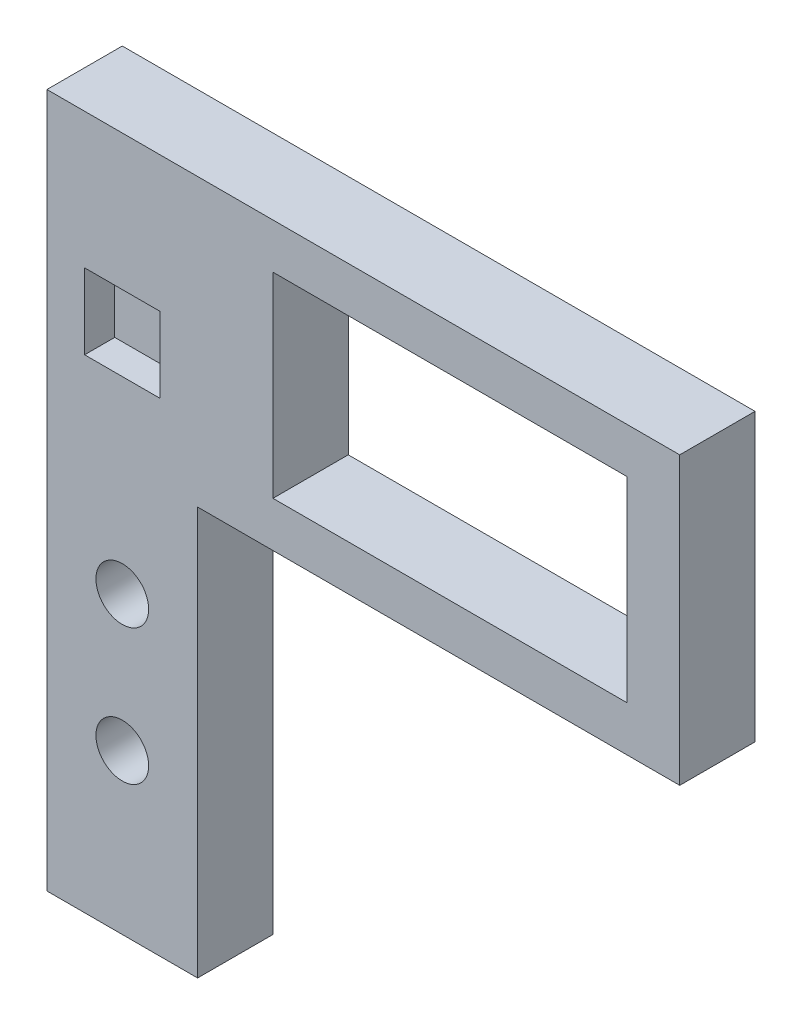
ISO-10303-21;
HEADER;
FILE_DESCRIPTION(('STEP AP214'),'2;1');
FILE_NAME('part.step','',(''),(''),'','','');
FILE_SCHEMA(('AUTOMOTIVE_DESIGN { 1 0 10303 214 1 1 1 1 }'));
ENDSEC;
DATA;
#1=APPLICATION_CONTEXT('core data for automotive mechanical design processes');
#2=APPLICATION_PROTOCOL_DEFINITION('international standard','automotive_design',2000,#1);
#3=PRODUCT_CONTEXT('',#1,'mechanical');
#4=PRODUCT('Part','Part','',(#3));
#5=PRODUCT_RELATED_PRODUCT_CATEGORY('part','',(#4));
#6=PRODUCT_DEFINITION_FORMATION('','',#4);
#7=PRODUCT_DEFINITION_CONTEXT('part definition',#1,'design');
#8=PRODUCT_DEFINITION('design','',#6,#7);
#9=PRODUCT_DEFINITION_SHAPE('','',#8);
#10=(LENGTH_UNIT() NAMED_UNIT(*) SI_UNIT(.MILLI.,.METRE.));
#11=(NAMED_UNIT(*) PLANE_ANGLE_UNIT() SI_UNIT($,.RADIAN.));
#12=(NAMED_UNIT(*) SI_UNIT($,.STERADIAN.) SOLID_ANGLE_UNIT());
#13=UNCERTAINTY_MEASURE_WITH_UNIT(LENGTH_MEASURE(1.E-05),#10,'distance_accuracy_value','');
#14=(GEOMETRIC_REPRESENTATION_CONTEXT(3) GLOBAL_UNCERTAINTY_ASSIGNED_CONTEXT((#13)) GLOBAL_UNIT_ASSIGNED_CONTEXT((#10,
#11,#12)) REPRESENTATION_CONTEXT('',''));
#15=CARTESIAN_POINT('',(0.,0.,0.));
#16=DIRECTION('',(0.,0.,1.));
#17=DIRECTION('',(1.,0.,0.));
#18=AXIS2_PLACEMENT_3D('',#15,#16,#17);
#19=CARTESIAN_POINT('',(0.,0.,5.));
#20=DIRECTION('',(0.,0.,1.));
#21=DIRECTION('',(1.,0.,0.));
#22=AXIS2_PLACEMENT_3D('',#19,#20,#21);
#23=PLANE('',#22);
#24=DIRECTION('',(0.,-1.,0.));
#25=VECTOR('',#24,1.);
#26=CARTESIAN_POINT('',(33.5,0.,5.));
#27=LINE('',#26,#25);
#28=CARTESIAN_POINT('',(33.5,30.9257415875545,5.));
#29=VERTEX_POINT('',#28);
#30=CARTESIAN_POINT('',(33.5,17.9257415875545,5.));
#31=VERTEX_POINT('',#30);
#32=EDGE_CURVE('E225',#29,#31,#27,.T.);
#33=ORIENTED_EDGE('',*,*,#32,.T.);
#34=DIRECTION('',(-1.,0.,0.));
#35=VECTOR('',#34,1.);
#36=CARTESIAN_POINT('',(0.,17.9257415875545,5.));
#37=LINE('',#36,#35);
#38=CARTESIAN_POINT('',(10.,17.9257415875545,5.));
#39=VERTEX_POINT('',#38);
#40=EDGE_CURVE('E113',#31,#39,#37,.T.);
#41=ORIENTED_EDGE('',*,*,#40,.T.);
#42=DIRECTION('',(0.,-1.,0.));
#43=VECTOR('',#42,1.);
#44=CARTESIAN_POINT('',(10.,0.,5.));
#45=LINE('',#44,#43);
#46=CARTESIAN_POINT('',(10.,30.9257415875545,5.));
#47=VERTEX_POINT('',#46);
#48=EDGE_CURVE('E258',#47,#39,#45,.T.);
#49=ORIENTED_EDGE('',*,*,#48,.F.);
#50=DIRECTION('',(1.,0.,0.));
#51=VECTOR('',#50,1.);
#52=CARTESIAN_POINT('',(0.,30.9257415875545,5.));
#53=LINE('',#52,#51);
#54=EDGE_CURVE('E260',#47,#29,#53,.T.);
#55=ORIENTED_EDGE('',*,*,#54,.T.);
#56=EDGE_LOOP('',(#33,#41,#49,#55));
#57=FACE_BOUND('',#56,.T.);
#58=DIRECTION('',(-1.,0.,0.));
#59=VECTOR('',#58,1.);
#60=CARTESIAN_POINT('',(0.,14.9257415875545,5.));
#61=LINE('',#60,#59);
#62=CARTESIAN_POINT('',(37.,14.9257415875545,5.));
#63=VERTEX_POINT('',#62);
#64=CARTESIAN_POINT('',(5.,14.9257415875545,5.));
#65=VERTEX_POINT('',#64);
#66=EDGE_CURVE('E264',#63,#65,#61,.T.);
#67=ORIENTED_EDGE('',*,*,#66,.F.);
#68=DIRECTION('',(0.,-1.,0.));
#69=VECTOR('',#68,1.);
#70=CARTESIAN_POINT('',(37.,0.,5.));
#71=LINE('',#70,#69);
#72=CARTESIAN_POINT('',(37.,33.9257415875545,5.));
#73=VERTEX_POINT('',#72);
#74=EDGE_CURVE('E274',#73,#63,#71,.T.);
#75=ORIENTED_EDGE('',*,*,#74,.F.);
#76=DIRECTION('',(-1.,0.,0.));
#77=VECTOR('',#76,1.);
#78=CARTESIAN_POINT('',(0.,33.9257415875545,5.));
#79=LINE('',#78,#77);
#80=CARTESIAN_POINT('',(-5.,33.9257415875545,5.));
#81=VERTEX_POINT('',#80);
#82=EDGE_CURVE('E147',#73,#81,#79,.T.);
#83=ORIENTED_EDGE('',*,*,#82,.T.);
#84=DIRECTION('',(0.,-1.,0.));
#85=VECTOR('',#84,1.);
#86=CARTESIAN_POINT('',(-5.,0.,5.));
#87=LINE('',#86,#85);
#88=CARTESIAN_POINT('',(-4.99999999999999,-12.1472359222569,5.));
#89=VERTEX_POINT('',#88);
#90=EDGE_CURVE('E138',#81,#89,#87,.T.);
#91=ORIENTED_EDGE('',*,*,#90,.T.);
#92=DIRECTION('',(-1.,0.,0.));
#93=VECTOR('',#92,1.);
#94=CARTESIAN_POINT('',(0.,-12.1472359222569,5.));
#95=LINE('',#94,#93);
#96=CARTESIAN_POINT('',(5.,-12.1472359222569,5.));
#97=VERTEX_POINT('',#96);
#98=EDGE_CURVE('E144',#97,#89,#95,.T.);
#99=ORIENTED_EDGE('',*,*,#98,.F.);
#100=DIRECTION('',(0.,-1.,0.));
#101=VECTOR('',#100,1.);
#102=CARTESIAN_POINT('',(5.,0.,5.));
#103=LINE('',#102,#101);
#104=EDGE_CURVE('E166',#65,#97,#103,.T.);
#105=ORIENTED_EDGE('',*,*,#104,.F.);
#106=EDGE_LOOP('',(#67,#75,#83,#91,#99,#105));
#107=FACE_BOUND('',#106,.T.);
#108=CARTESIAN_POINT('',(0.,-1.57425841244552,5.));
#109=DIRECTION('',(0.,0.,1.));
#110=DIRECTION('',(1.,0.,0.));
#111=AXIS2_PLACEMENT_3D('',#108,#109,#110);
#112=CIRCLE('',#111,1.75);
#113=CARTESIAN_POINT('',(1.75,-1.57425841244552,5.));
#114=VERTEX_POINT('',#113);
#115=EDGE_CURVE('E169',#114,#114,#112,.T.);
#116=ORIENTED_EDGE('',*,*,#115,.F.);
#117=EDGE_LOOP('',(#116));
#118=FACE_BOUND('',#117,.T.);
#119=CARTESIAN_POINT('',(0.,7.42574158755448,5.));
#120=DIRECTION('',(0.,0.,1.));
#121=DIRECTION('',(1.,0.,0.));
#122=AXIS2_PLACEMENT_3D('',#119,#120,#121);
#123=CIRCLE('',#122,1.75);
#124=CARTESIAN_POINT('',(1.75,7.42574158755448,5.));
#125=VERTEX_POINT('',#124);
#126=EDGE_CURVE('E176',#125,#125,#123,.T.);
#127=ORIENTED_EDGE('',*,*,#126,.F.);
#128=EDGE_LOOP('',(#127));
#129=FACE_BOUND('',#128,.T.);
#130=DIRECTION('',(-1.,0.,0.));
#131=VECTOR('',#130,1.);
#132=CARTESIAN_POINT('',(-2.5,19.9257415875545,5.));
#133=LINE('',#132,#131);
#134=CARTESIAN_POINT('',(2.5,19.9257415875545,5.));
#135=VERTEX_POINT('',#134);
#136=CARTESIAN_POINT('',(-2.5,19.9257415875545,5.));
#137=VERTEX_POINT('',#136);
#138=EDGE_CURVE('E522',#135,#137,#133,.T.);
#139=ORIENTED_EDGE('',*,*,#138,.T.);
#140=DIRECTION('',(0.,1.,0.));
#141=VECTOR('',#140,1.);
#142=CARTESIAN_POINT('',(-2.5,24.9257415875545,5.));
#143=LINE('',#142,#141);
#144=CARTESIAN_POINT('',(-2.5,24.9257415875545,5.));
#145=VERTEX_POINT('',#144);
#146=EDGE_CURVE('E59',#137,#145,#143,.T.);
#147=ORIENTED_EDGE('',*,*,#146,.T.);
#148=DIRECTION('',(1.,0.,0.));
#149=VECTOR('',#148,1.);
#150=CARTESIAN_POINT('',(-2.5,24.9257415875545,5.));
#151=LINE('',#150,#149);
#152=CARTESIAN_POINT('',(2.5,24.9257415875545,5.));
#153=VERTEX_POINT('',#152);
#154=EDGE_CURVE('E540',#145,#153,#151,.T.);
#155=ORIENTED_EDGE('',*,*,#154,.T.);
#156=DIRECTION('',(0.,-1.,0.));
#157=VECTOR('',#156,1.);
#158=CARTESIAN_POINT('',(2.5,24.9257415875545,5.));
#159=LINE('',#158,#157);
#160=EDGE_CURVE('E529',#153,#135,#159,.T.);
#161=ORIENTED_EDGE('',*,*,#160,.T.);
#162=EDGE_LOOP('',(#139,#147,#155,#161));
#163=FACE_BOUND('',#162,.T.);
#164=ADVANCED_FACE('F41',(#57,#107,#118,#129,#163),#23,.T.);
#165=CARTESIAN_POINT('',(0.,14.9257415875545,5.));
#166=DIRECTION('',(0.,-1.,0.));
#167=DIRECTION('',(1.,0.,0.));
#168=AXIS2_PLACEMENT_3D('',#165,#166,#167);
#169=PLANE('',#168);
#170=DIRECTION('',(-1.,0.,0.));
#171=VECTOR('',#170,1.);
#172=CARTESIAN_POINT('',(0.,14.9257415875545,0.));
#173=LINE('',#172,#171);
#174=CARTESIAN_POINT('',(37.,14.9257415875545,0.));
#175=VERTEX_POINT('',#174);
#176=CARTESIAN_POINT('',(5.,14.9257415875545,0.));
#177=VERTEX_POINT('',#176);
#178=EDGE_CURVE('E197',#175,#177,#173,.T.);
#179=ORIENTED_EDGE('',*,*,#178,.F.);
#180=DIRECTION('',(0.,0.,-1.));
#181=VECTOR('',#180,1.);
#182=CARTESIAN_POINT('',(37.,14.9257415875545,5.));
#183=LINE('',#182,#181);
#184=EDGE_CURVE('E11',#63,#175,#183,.T.);
#185=ORIENTED_EDGE('',*,*,#184,.F.);
#186=ORIENTED_EDGE('',*,*,#66,.T.);
#187=DIRECTION('',(0.,0.,-1.));
#188=VECTOR('',#187,1.);
#189=CARTESIAN_POINT('',(5.,14.9257415875545,5.));
#190=LINE('',#189,#188);
#191=EDGE_CURVE('E68',#65,#177,#190,.T.);
#192=ORIENTED_EDGE('',*,*,#191,.T.);
#193=EDGE_LOOP('',(#179,#185,#186,#192));
#194=FACE_BOUND('',#193,.T.);
#195=ADVANCED_FACE('F281',(#194),#169,.T.);
#196=CARTESIAN_POINT('',(37.,0.,5.));
#197=DIRECTION('',(1.,0.,0.));
#198=DIRECTION('',(0.,0.,-1.));
#199=AXIS2_PLACEMENT_3D('',#196,#197,#198);
#200=PLANE('',#199);
#201=DIRECTION('',(0.,-1.,0.));
#202=VECTOR('',#201,1.);
#203=CARTESIAN_POINT('',(37.,0.,0.));
#204=LINE('',#203,#202);
#205=CARTESIAN_POINT('',(37.,33.9257415875545,0.));
#206=VERTEX_POINT('',#205);
#207=EDGE_CURVE('E200',#206,#175,#204,.T.);
#208=ORIENTED_EDGE('',*,*,#207,.F.);
#209=DIRECTION('',(0.,0.,-1.));
#210=VECTOR('',#209,1.);
#211=CARTESIAN_POINT('',(37.,33.9257415875545,5.));
#212=LINE('',#211,#210);
#213=EDGE_CURVE('E51',#73,#206,#212,.T.);
#214=ORIENTED_EDGE('',*,*,#213,.F.);
#215=ORIENTED_EDGE('',*,*,#74,.T.);
#216=ORIENTED_EDGE('',*,*,#184,.T.);
#217=EDGE_LOOP('',(#208,#214,#215,#216));
#218=FACE_BOUND('',#217,.T.);
#219=ADVANCED_FACE('F280',(#218),#200,.T.);
#220=CARTESIAN_POINT('',(0.,33.9257415875545,5.));
#221=DIRECTION('',(0.,-1.,0.));
#222=DIRECTION('',(0.,0.,-1.));
#223=AXIS2_PLACEMENT_3D('',#220,#221,#222);
#224=PLANE('',#223);
#225=DIRECTION('',(-1.,0.,0.));
#226=VECTOR('',#225,1.);
#227=CARTESIAN_POINT('',(0.,33.9257415875545,0.));
#228=LINE('',#227,#226);
#229=CARTESIAN_POINT('',(-5.,33.9257415875545,0.));
#230=VERTEX_POINT('',#229);
#231=EDGE_CURVE('E204',#206,#230,#228,.T.);
#232=ORIENTED_EDGE('',*,*,#231,.T.);
#233=DIRECTION('',(0.,0.,-1.));
#234=VECTOR('',#233,1.);
#235=CARTESIAN_POINT('',(-5.,33.9257415875545,5.));
#236=LINE('',#235,#234);
#237=EDGE_CURVE('E161',#81,#230,#236,.T.);
#238=ORIENTED_EDGE('',*,*,#237,.F.);
#239=ORIENTED_EDGE('',*,*,#82,.F.);
#240=ORIENTED_EDGE('',*,*,#213,.T.);
#241=EDGE_LOOP('',(#232,#238,#239,#240));
#242=FACE_BOUND('',#241,.T.);
#243=ADVANCED_FACE('F285',(#242),#224,.F.);
#244=CARTESIAN_POINT('',(-5.,0.,5.));
#245=DIRECTION('',(1.,0.,0.));
#246=DIRECTION('',(0.,1.,0.));
#247=AXIS2_PLACEMENT_3D('',#244,#245,#246);
#248=PLANE('',#247);
#249=DIRECTION('',(0.,-1.,0.));
#250=VECTOR('',#249,1.);
#251=CARTESIAN_POINT('',(-5.,0.,0.));
#252=LINE('',#251,#250);
#253=CARTESIAN_POINT('',(-4.99999999999999,-12.1472359222569,0.));
#254=VERTEX_POINT('',#253);
#255=EDGE_CURVE('E156',#230,#254,#252,.T.);
#256=ORIENTED_EDGE('',*,*,#255,.T.);
#257=DIRECTION('',(0.,0.,-1.));
#258=VECTOR('',#257,1.);
#259=CARTESIAN_POINT('',(-4.99999999999999,-12.1472359222569,5.));
#260=LINE('',#259,#258);
#261=EDGE_CURVE('E154',#89,#254,#260,.T.);
#262=ORIENTED_EDGE('',*,*,#261,.F.);
#263=ORIENTED_EDGE('',*,*,#90,.F.);
#264=ORIENTED_EDGE('',*,*,#237,.T.);
#265=EDGE_LOOP('',(#256,#262,#263,#264));
#266=FACE_BOUND('',#265,.T.);
#267=ADVANCED_FACE('F155',(#266),#248,.F.);
#268=CARTESIAN_POINT('',(0.,-12.1472359222569,5.));
#269=DIRECTION('',(0.,-1.,0.));
#270=DIRECTION('',(1.,0.,0.));
#271=AXIS2_PLACEMENT_3D('',#268,#269,#270);
#272=PLANE('',#271);
#273=DIRECTION('',(-1.,0.,0.));
#274=VECTOR('',#273,1.);
#275=CARTESIAN_POINT('',(0.,-12.1472359222569,0.));
#276=LINE('',#275,#274);
#277=CARTESIAN_POINT('',(5.,-12.1472359222569,0.));
#278=VERTEX_POINT('',#277);
#279=EDGE_CURVE('E210',#278,#254,#276,.T.);
#280=ORIENTED_EDGE('',*,*,#279,.F.);
#281=DIRECTION('',(0.,0.,-1.));
#282=VECTOR('',#281,1.);
#283=CARTESIAN_POINT('',(5.,-12.1472359222569,5.));
#284=LINE('',#283,#282);
#285=EDGE_CURVE('E162',#97,#278,#284,.T.);
#286=ORIENTED_EDGE('',*,*,#285,.F.);
#287=ORIENTED_EDGE('',*,*,#98,.T.);
#288=ORIENTED_EDGE('',*,*,#261,.T.);
#289=EDGE_LOOP('',(#280,#286,#287,#288));
#290=FACE_BOUND('',#289,.T.);
#291=ADVANCED_FACE('F164',(#290),#272,.T.);
#292=CARTESIAN_POINT('',(33.5,0.,5.));
#293=DIRECTION('',(1.,0.,0.));
#294=DIRECTION('',(0.,0.,-1.));
#295=AXIS2_PLACEMENT_3D('',#292,#293,#294);
#296=PLANE('',#295);
#297=DIRECTION('',(0.,-1.,0.));
#298=VECTOR('',#297,1.);
#299=CARTESIAN_POINT('',(33.5,0.,0.));
#300=LINE('',#299,#298);
#301=CARTESIAN_POINT('',(33.5,30.9257415875545,0.));
#302=VERTEX_POINT('',#301);
#303=CARTESIAN_POINT('',(33.5,17.9257415875545,0.));
#304=VERTEX_POINT('',#303);
#305=EDGE_CURVE('E181',#302,#304,#300,.T.);
#306=ORIENTED_EDGE('',*,*,#305,.T.);
#307=DIRECTION('',(0.,0.,-1.));
#308=VECTOR('',#307,1.);
#309=CARTESIAN_POINT('',(33.5,17.9257415875545,5.));
#310=LINE('',#309,#308);
#311=EDGE_CURVE('E45',#31,#304,#310,.T.);
#312=ORIENTED_EDGE('',*,*,#311,.F.);
#313=ORIENTED_EDGE('',*,*,#32,.F.);
#314=DIRECTION('',(0.,0.,-1.));
#315=VECTOR('',#314,1.);
#316=CARTESIAN_POINT('',(33.5,30.9257415875545,5.));
#317=LINE('',#316,#315);
#318=EDGE_CURVE('E180',#29,#302,#317,.T.);
#319=ORIENTED_EDGE('',*,*,#318,.T.);
#320=EDGE_LOOP('',(#306,#312,#313,#319));
#321=FACE_BOUND('',#320,.T.);
#322=ADVANCED_FACE('F43',(#321),#296,.F.);
#323=CARTESIAN_POINT('',(0.,17.9257415875545,5.));
#324=DIRECTION('',(0.,-1.,0.));
#325=DIRECTION('',(0.,0.,-1.));
#326=AXIS2_PLACEMENT_3D('',#323,#324,#325);
#327=PLANE('',#326);
#328=DIRECTION('',(-1.,0.,0.));
#329=VECTOR('',#328,1.);
#330=CARTESIAN_POINT('',(0.,17.9257415875545,0.));
#331=LINE('',#330,#329);
#332=CARTESIAN_POINT('',(10.,17.9257415875545,0.));
#333=VERTEX_POINT('',#332);
#334=EDGE_CURVE('E185',#304,#333,#331,.T.);
#335=ORIENTED_EDGE('',*,*,#334,.T.);
#336=DIRECTION('',(0.,0.,-1.));
#337=VECTOR('',#336,1.);
#338=CARTESIAN_POINT('',(10.,17.9257415875545,5.));
#339=LINE('',#338,#337);
#340=EDGE_CURVE('E239',#39,#333,#339,.T.);
#341=ORIENTED_EDGE('',*,*,#340,.F.);
#342=ORIENTED_EDGE('',*,*,#40,.F.);
#343=ORIENTED_EDGE('',*,*,#311,.T.);
#344=EDGE_LOOP('',(#335,#341,#342,#343));
#345=FACE_BOUND('',#344,.T.);
#346=ADVANCED_FACE('F246',(#345),#327,.F.);
#347=CARTESIAN_POINT('',(10.,0.,5.));
#348=DIRECTION('',(1.,0.,0.));
#349=DIRECTION('',(0.,1.,0.));
#350=AXIS2_PLACEMENT_3D('',#347,#348,#349);
#351=PLANE('',#350);
#352=DIRECTION('',(0.,-1.,0.));
#353=VECTOR('',#352,1.);
#354=CARTESIAN_POINT('',(10.,0.,0.));
#355=LINE('',#354,#353);
#356=CARTESIAN_POINT('',(10.,30.9257415875545,0.));
#357=VERTEX_POINT('',#356);
#358=EDGE_CURVE('E190',#357,#333,#355,.T.);
#359=ORIENTED_EDGE('',*,*,#358,.F.);
#360=DIRECTION('',(0.,0.,-1.));
#361=VECTOR('',#360,1.);
#362=CARTESIAN_POINT('',(10.,30.9257415875545,5.));
#363=LINE('',#362,#361);
#364=EDGE_CURVE('E237',#47,#357,#363,.T.);
#365=ORIENTED_EDGE('',*,*,#364,.F.);
#366=ORIENTED_EDGE('',*,*,#48,.T.);
#367=ORIENTED_EDGE('',*,*,#340,.T.);
#368=EDGE_LOOP('',(#359,#365,#366,#367));
#369=FACE_BOUND('',#368,.T.);
#370=ADVANCED_FACE('F255',(#369),#351,.T.);
#371=CARTESIAN_POINT('',(0.,-1.57425841244552,5.));
#372=DIRECTION('',(0.,0.,-1.));
#373=DIRECTION('',(-1.,0.,0.));
#374=AXIS2_PLACEMENT_3D('',#371,#372,#373);
#375=CYLINDRICAL_SURFACE('',#374,1.75);
#376=ORIENTED_EDGE('',*,*,#115,.T.);
#377=EDGE_LOOP('',(#376));
#378=FACE_BOUND('',#377,.T.);
#379=CARTESIAN_POINT('',(0.,-1.57425841244552,0.));
#380=DIRECTION('',(0.,0.,1.));
#381=DIRECTION('',(1.,0.,0.));
#382=AXIS2_PLACEMENT_3D('',#379,#380,#381);
#383=CIRCLE('',#382,1.75);
#384=CARTESIAN_POINT('',(1.75,-1.57425841244552,0.));
#385=VERTEX_POINT('',#384);
#386=EDGE_CURVE('E217',#385,#385,#383,.T.);
#387=ORIENTED_EDGE('',*,*,#386,.F.);
#388=EDGE_LOOP('',(#387));
#389=FACE_BOUND('',#388,.T.);
#390=ADVANCED_FACE('F310',(#378,#389),#375,.F.);
#391=CARTESIAN_POINT('',(5.,0.,5.));
#392=DIRECTION('',(1.,0.,0.));
#393=DIRECTION('',(0.,0.,-1.));
#394=AXIS2_PLACEMENT_3D('',#391,#392,#393);
#395=PLANE('',#394);
#396=DIRECTION('',(0.,-1.,0.));
#397=VECTOR('',#396,1.);
#398=CARTESIAN_POINT('',(5.,0.,0.));
#399=LINE('',#398,#397);
#400=EDGE_CURVE('E213',#177,#278,#399,.T.);
#401=ORIENTED_EDGE('',*,*,#400,.F.);
#402=ORIENTED_EDGE('',*,*,#191,.F.);
#403=ORIENTED_EDGE('',*,*,#104,.T.);
#404=ORIENTED_EDGE('',*,*,#285,.T.);
#405=EDGE_LOOP('',(#401,#402,#403,#404));
#406=FACE_BOUND('',#405,.T.);
#407=ADVANCED_FACE('F313',(#406),#395,.T.);
#408=CARTESIAN_POINT('',(0.,30.9257415875545,5.));
#409=DIRECTION('',(0.,1.,0.));
#410=DIRECTION('',(0.,0.,1.));
#411=AXIS2_PLACEMENT_3D('',#408,#409,#410);
#412=PLANE('',#411);
#413=DIRECTION('',(1.,0.,0.));
#414=VECTOR('',#413,1.);
#415=CARTESIAN_POINT('',(0.,30.9257415875545,0.));
#416=LINE('',#415,#414);
#417=EDGE_CURVE('E194',#357,#302,#416,.T.);
#418=ORIENTED_EDGE('',*,*,#417,.T.);
#419=ORIENTED_EDGE('',*,*,#318,.F.);
#420=ORIENTED_EDGE('',*,*,#54,.F.);
#421=ORIENTED_EDGE('',*,*,#364,.T.);
#422=EDGE_LOOP('',(#418,#419,#420,#421));
#423=FACE_BOUND('',#422,.T.);
#424=ADVANCED_FACE('F261',(#423),#412,.F.);
#425=CARTESIAN_POINT('',(0.,7.42574158755448,5.));
#426=DIRECTION('',(0.,0.,-1.));
#427=DIRECTION('',(-1.,0.,0.));
#428=AXIS2_PLACEMENT_3D('',#425,#426,#427);
#429=CYLINDRICAL_SURFACE('',#428,1.75);
#430=ORIENTED_EDGE('',*,*,#126,.T.);
#431=EDGE_LOOP('',(#430));
#432=FACE_BOUND('',#431,.T.);
#433=CARTESIAN_POINT('',(0.,7.42574158755448,0.));
#434=DIRECTION('',(0.,0.,1.));
#435=DIRECTION('',(1.,0.,0.));
#436=AXIS2_PLACEMENT_3D('',#433,#434,#435);
#437=CIRCLE('',#436,1.75);
#438=CARTESIAN_POINT('',(1.75,7.42574158755448,0.));
#439=VERTEX_POINT('',#438);
#440=EDGE_CURVE('E221',#439,#439,#437,.T.);
#441=ORIENTED_EDGE('',*,*,#440,.F.);
#442=EDGE_LOOP('',(#441));
#443=FACE_BOUND('',#442,.T.);
#444=ADVANCED_FACE('F306',(#432,#443),#429,.F.);
#445=CARTESIAN_POINT('',(0.,0.,0.));
#446=DIRECTION('',(0.,0.,1.));
#447=DIRECTION('',(1.,0.,0.));
#448=AXIS2_PLACEMENT_3D('',#445,#446,#447);
#449=PLANE('',#448);
#450=ORIENTED_EDGE('',*,*,#305,.F.);
#451=ORIENTED_EDGE('',*,*,#417,.F.);
#452=ORIENTED_EDGE('',*,*,#358,.T.);
#453=ORIENTED_EDGE('',*,*,#334,.F.);
#454=EDGE_LOOP('',(#450,#451,#452,#453));
#455=FACE_BOUND('',#454,.T.);
#456=ORIENTED_EDGE('',*,*,#178,.T.);
#457=ORIENTED_EDGE('',*,*,#400,.T.);
#458=ORIENTED_EDGE('',*,*,#279,.T.);
#459=ORIENTED_EDGE('',*,*,#255,.F.);
#460=ORIENTED_EDGE('',*,*,#231,.F.);
#461=ORIENTED_EDGE('',*,*,#207,.T.);
#462=EDGE_LOOP('',(#456,#457,#458,#459,#460,#461));
#463=FACE_BOUND('',#462,.T.);
#464=ORIENTED_EDGE('',*,*,#386,.T.);
#465=EDGE_LOOP('',(#464));
#466=FACE_BOUND('',#465,.T.);
#467=ORIENTED_EDGE('',*,*,#440,.T.);
#468=EDGE_LOOP('',(#467));
#469=FACE_BOUND('',#468,.T.);
#470=ADVANCED_FACE('F253',(#455,#463,#466,#469),#449,.F.);
#471=CARTESIAN_POINT('',(-2.5,24.9257415875545,3.));
#472=DIRECTION('',(1.,0.,0.));
#473=DIRECTION('',(0.,1.,0.));
#474=AXIS2_PLACEMENT_3D('',#471,#472,#473);
#475=PLANE('',#474);
#476=ORIENTED_EDGE('',*,*,#146,.F.);
#477=DIRECTION('',(0.,0.,1.));
#478=VECTOR('',#477,1.);
#479=CARTESIAN_POINT('',(-2.5,19.9257415875545,3.));
#480=LINE('',#479,#478);
#481=CARTESIAN_POINT('',(-2.5,19.9257415875545,3.));
#482=VERTEX_POINT('',#481);
#483=EDGE_CURVE('E537',#482,#137,#480,.T.);
#484=ORIENTED_EDGE('',*,*,#483,.F.);
#485=DIRECTION('',(0.,1.,0.));
#486=VECTOR('',#485,1.);
#487=CARTESIAN_POINT('',(-2.5,24.9257415875545,3.));
#488=LINE('',#487,#486);
#489=CARTESIAN_POINT('',(-2.5,24.9257415875545,3.));
#490=VERTEX_POINT('',#489);
#491=EDGE_CURVE('E511',#482,#490,#488,.T.);
#492=ORIENTED_EDGE('',*,*,#491,.T.);
#493=DIRECTION('',(0.,0.,1.));
#494=VECTOR('',#493,1.);
#495=CARTESIAN_POINT('',(-2.5,24.9257415875545,3.));
#496=LINE('',#495,#494);
#497=EDGE_CURVE('E186',#490,#145,#496,.T.);
#498=ORIENTED_EDGE('',*,*,#497,.T.);
#499=EDGE_LOOP('',(#476,#484,#492,#498));
#500=FACE_BOUND('',#499,.T.);
#501=ADVANCED_FACE('F302',(#500),#475,.T.);
#502=CARTESIAN_POINT('',(-2.5,24.9257415875545,3.));
#503=DIRECTION('',(0.,-1.,0.));
#504=DIRECTION('',(0.,0.,-1.));
#505=AXIS2_PLACEMENT_3D('',#502,#503,#504);
#506=PLANE('',#505);
#507=ORIENTED_EDGE('',*,*,#154,.F.);
#508=ORIENTED_EDGE('',*,*,#497,.F.);
#509=DIRECTION('',(1.,0.,0.));
#510=VECTOR('',#509,1.);
#511=CARTESIAN_POINT('',(-2.5,24.9257415875545,3.));
#512=LINE('',#511,#510);
#513=CARTESIAN_POINT('',(2.5,24.9257415875545,3.));
#514=VERTEX_POINT('',#513);
#515=EDGE_CURVE('E518',#490,#514,#512,.T.);
#516=ORIENTED_EDGE('',*,*,#515,.T.);
#517=DIRECTION('',(0.,0.,1.));
#518=VECTOR('',#517,1.);
#519=CARTESIAN_POINT('',(2.5,24.9257415875545,3.));
#520=LINE('',#519,#518);
#521=EDGE_CURVE('E553',#514,#153,#520,.T.);
#522=ORIENTED_EDGE('',*,*,#521,.T.);
#523=EDGE_LOOP('',(#507,#508,#516,#522));
#524=FACE_BOUND('',#523,.T.);
#525=ADVANCED_FACE('F348',(#524),#506,.T.);
#526=CARTESIAN_POINT('',(2.5,24.9257415875545,3.));
#527=DIRECTION('',(-1.,0.,0.));
#528=DIRECTION('',(0.,-1.,0.));
#529=AXIS2_PLACEMENT_3D('',#526,#527,#528);
#530=PLANE('',#529);
#531=ORIENTED_EDGE('',*,*,#160,.F.);
#532=ORIENTED_EDGE('',*,*,#521,.F.);
#533=DIRECTION('',(0.,-1.,0.));
#534=VECTOR('',#533,1.);
#535=CARTESIAN_POINT('',(2.5,24.9257415875545,3.));
#536=LINE('',#535,#534);
#537=CARTESIAN_POINT('',(2.5,19.9257415875545,3.));
#538=VERTEX_POINT('',#537);
#539=EDGE_CURVE('E526',#514,#538,#536,.T.);
#540=ORIENTED_EDGE('',*,*,#539,.T.);
#541=DIRECTION('',(0.,0.,1.));
#542=VECTOR('',#541,1.);
#543=CARTESIAN_POINT('',(2.5,19.9257415875545,3.));
#544=LINE('',#543,#542);
#545=EDGE_CURVE('E549',#538,#135,#544,.T.);
#546=ORIENTED_EDGE('',*,*,#545,.T.);
#547=EDGE_LOOP('',(#531,#532,#540,#546));
#548=FACE_BOUND('',#547,.T.);
#549=ADVANCED_FACE('F354',(#548),#530,.T.);
#550=CARTESIAN_POINT('',(-2.5,19.9257415875545,3.));
#551=DIRECTION('',(0.,1.,0.));
#552=DIRECTION('',(0.,0.,1.));
#553=AXIS2_PLACEMENT_3D('',#550,#551,#552);
#554=PLANE('',#553);
#555=ORIENTED_EDGE('',*,*,#138,.F.);
#556=ORIENTED_EDGE('',*,*,#545,.F.);
#557=DIRECTION('',(-1.,0.,0.));
#558=VECTOR('',#557,1.);
#559=CARTESIAN_POINT('',(-2.5,19.9257415875545,3.));
#560=LINE('',#559,#558);
#561=EDGE_CURVE('E515',#538,#482,#560,.T.);
#562=ORIENTED_EDGE('',*,*,#561,.T.);
#563=ORIENTED_EDGE('',*,*,#483,.T.);
#564=EDGE_LOOP('',(#555,#556,#562,#563));
#565=FACE_BOUND('',#564,.T.);
#566=ADVANCED_FACE('F361',(#565),#554,.T.);
#567=CARTESIAN_POINT('',(0.,0.,3.));
#568=DIRECTION('',(0.,0.,1.));
#569=DIRECTION('',(1.,0.,0.));
#570=AXIS2_PLACEMENT_3D('',#567,#568,#569);
#571=PLANE('',#570);
#572=ORIENTED_EDGE('',*,*,#491,.F.);
#573=ORIENTED_EDGE('',*,*,#561,.F.);
#574=ORIENTED_EDGE('',*,*,#539,.F.);
#575=ORIENTED_EDGE('',*,*,#515,.F.);
#576=EDGE_LOOP('',(#572,#573,#574,#575));
#577=FACE_BOUND('',#576,.T.);
#578=ADVANCED_FACE('F369',(#577),#571,.T.);
#579=CLOSED_SHELL('',(#164,#195,#219,#243,#267,#291,#322,#346,#370,#390,#407,#424,#444,#470,
#501,#525,#549,#566,#578));
#580=MANIFOLD_SOLID_BREP('B2',#579);
#581=ADVANCED_BREP_SHAPE_REPRESENTATION('',(#18,#580),#14);
#582=SHAPE_DEFINITION_REPRESENTATION(#9,#581);
ENDSEC;
END-ISO-10303-21;
